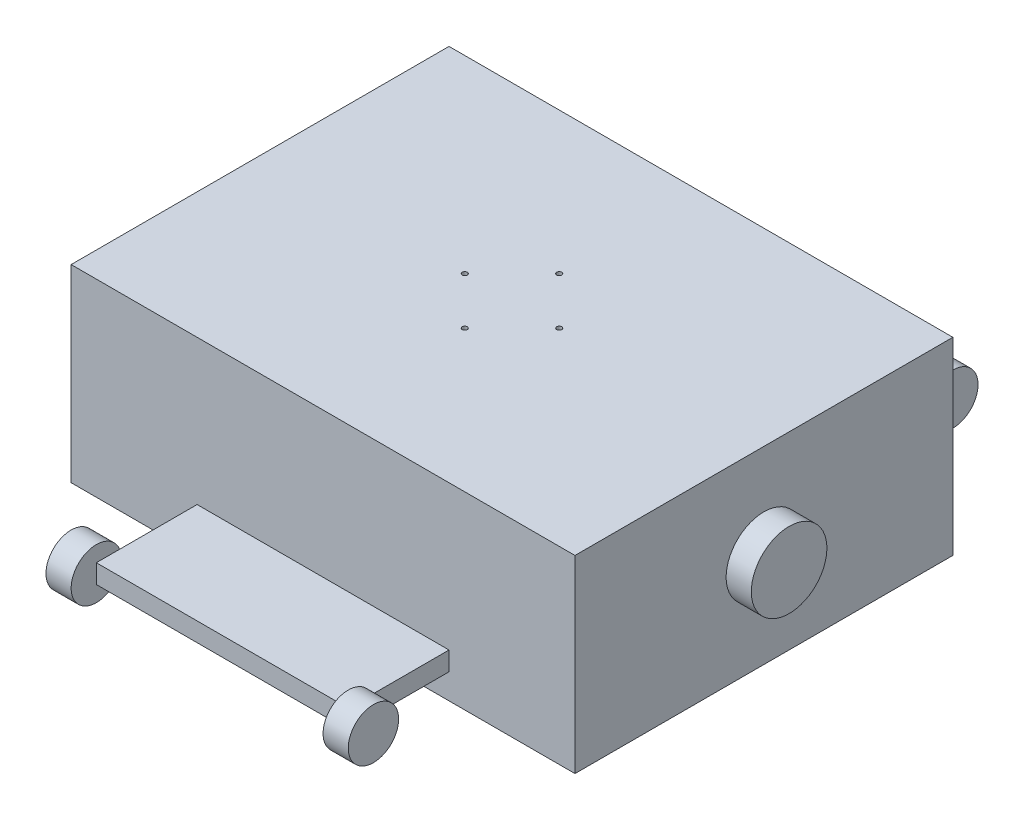
ISO-10303-21;
HEADER;
FILE_DESCRIPTION(('STEP AP214'),'2;1');
FILE_NAME('part.step','',(''),(''),'','','');
FILE_SCHEMA(('AUTOMOTIVE_DESIGN { 1 0 10303 214 1 1 1 1 }'));
ENDSEC;
DATA;
#1=APPLICATION_CONTEXT('core data for automotive mechanical design processes');
#2=APPLICATION_PROTOCOL_DEFINITION('international standard','automotive_design',2000,#1);
#3=PRODUCT_CONTEXT('',#1,'mechanical');
#4=PRODUCT('Part','Part','',(#3));
#5=PRODUCT_RELATED_PRODUCT_CATEGORY('part','',(#4));
#6=PRODUCT_DEFINITION_FORMATION('','',#4);
#7=PRODUCT_DEFINITION_CONTEXT('part definition',#1,'design');
#8=PRODUCT_DEFINITION('design','',#6,#7);
#9=PRODUCT_DEFINITION_SHAPE('','',#8);
#10=(LENGTH_UNIT() NAMED_UNIT(*) SI_UNIT(.MILLI.,.METRE.));
#11=(NAMED_UNIT(*) PLANE_ANGLE_UNIT() SI_UNIT($,.RADIAN.));
#12=(NAMED_UNIT(*) SI_UNIT($,.STERADIAN.) SOLID_ANGLE_UNIT());
#13=UNCERTAINTY_MEASURE_WITH_UNIT(LENGTH_MEASURE(1.E-05),#10,'distance_accuracy_value','');
#14=(GEOMETRIC_REPRESENTATION_CONTEXT(3) GLOBAL_UNCERTAINTY_ASSIGNED_CONTEXT((#13)) GLOBAL_UNIT_ASSIGNED_CONTEXT((#10,
#11,#12)) REPRESENTATION_CONTEXT('',''));
#15=CARTESIAN_POINT('',(0.,0.,0.));
#16=DIRECTION('',(0.,0.,1.));
#17=DIRECTION('',(1.,0.,0.));
#18=AXIS2_PLACEMENT_3D('',#15,#16,#17);
#19=CARTESIAN_POINT('',(0.,0.,0.));
#20=DIRECTION('',(0.,0.,1.));
#21=DIRECTION('',(1.,0.,0.));
#22=AXIS2_PLACEMENT_3D('',#19,#20,#21);
#23=PLANE('',#22);
#24=DIRECTION('',(0.,1.,0.));
#25=VECTOR('',#24,1.);
#26=CARTESIAN_POINT('',(200.,75.,0.));
#27=LINE('',#26,#25);
#28=CARTESIAN_POINT('',(200.,-75.,0.));
#29=VERTEX_POINT('',#28);
#30=CARTESIAN_POINT('',(200.,75.,0.));
#31=VERTEX_POINT('',#30);
#32=EDGE_CURVE('E201',#29,#31,#27,.T.);
#33=ORIENTED_EDGE('',*,*,#32,.T.);
#34=DIRECTION('',(-1.,0.,0.));
#35=VECTOR('',#34,1.);
#36=CARTESIAN_POINT('',(-200.,75.,0.));
#37=LINE('',#36,#35);
#38=CARTESIAN_POINT('',(-200.,75.,0.));
#39=VERTEX_POINT('',#38);
#40=EDGE_CURVE('E220',#31,#39,#37,.T.);
#41=ORIENTED_EDGE('',*,*,#40,.T.);
#42=DIRECTION('',(0.,-1.,0.));
#43=VECTOR('',#42,1.);
#44=CARTESIAN_POINT('',(-200.,75.,0.));
#45=LINE('',#44,#43);
#46=CARTESIAN_POINT('',(-200.,-75.,0.));
#47=VERTEX_POINT('',#46);
#48=EDGE_CURVE('E223',#39,#47,#45,.T.);
#49=ORIENTED_EDGE('',*,*,#48,.T.);
#50=DIRECTION('',(1.,0.,0.));
#51=VECTOR('',#50,1.);
#52=CARTESIAN_POINT('',(-200.,-75.,0.));
#53=LINE('',#52,#51);
#54=EDGE_CURVE('E209',#47,#29,#53,.T.);
#55=ORIENTED_EDGE('',*,*,#54,.T.);
#56=EDGE_LOOP('',(#33,#41,#49,#55));
#57=FACE_BOUND('',#56,.T.);
#58=DIRECTION('',(1.,0.,0.));
#59=VECTOR('',#58,1.);
#60=CARTESIAN_POINT('',(100.,-55.,0.));
#61=LINE('',#60,#59);
#62=CARTESIAN_POINT('',(-100.,-55.,0.));
#63=VERTEX_POINT('',#62);
#64=CARTESIAN_POINT('',(100.,-55.,0.));
#65=VERTEX_POINT('',#64);
#66=EDGE_CURVE('E495',#63,#65,#61,.T.);
#67=ORIENTED_EDGE('',*,*,#66,.F.);
#68=DIRECTION('',(0.,-1.,0.));
#69=VECTOR('',#68,1.);
#70=CARTESIAN_POINT('',(-100.,-55.,0.));
#71=LINE('',#70,#69);
#72=CARTESIAN_POINT('',(-100.,-40.,0.));
#73=VERTEX_POINT('',#72);
#74=EDGE_CURVE('E487',#73,#63,#71,.T.);
#75=ORIENTED_EDGE('',*,*,#74,.F.);
#76=DIRECTION('',(-1.,0.,0.));
#77=VECTOR('',#76,1.);
#78=CARTESIAN_POINT('',(100.,-40.,0.));
#79=LINE('',#78,#77);
#80=CARTESIAN_POINT('',(100.,-40.,0.));
#81=VERTEX_POINT('',#80);
#82=EDGE_CURVE('E182',#81,#73,#79,.T.);
#83=ORIENTED_EDGE('',*,*,#82,.F.);
#84=DIRECTION('',(0.,1.,0.));
#85=VECTOR('',#84,1.);
#86=CARTESIAN_POINT('',(100.,-55.,0.));
#87=LINE('',#86,#85);
#88=EDGE_CURVE('E497',#65,#81,#87,.T.);
#89=ORIENTED_EDGE('',*,*,#88,.F.);
#90=EDGE_LOOP('',(#67,#75,#83,#89));
#91=FACE_BOUND('',#90,.T.);
#92=ADVANCED_FACE('F39',(#57,#91),#23,.T.);
#93=CARTESIAN_POINT('',(200.,75.,-300.));
#94=DIRECTION('',(1.,0.,0.));
#95=DIRECTION('',(0.,1.,0.));
#96=AXIS2_PLACEMENT_3D('',#93,#94,#95);
#97=PLANE('',#96);
#98=CARTESIAN_POINT('',(200.,0.,-150.));
#99=DIRECTION('',(1.,0.,0.));
#100=DIRECTION('',(0.,1.,0.));
#101=AXIS2_PLACEMENT_3D('',#98,#99,#100);
#102=CIRCLE('',#101,30.);
#103=CARTESIAN_POINT('',(200.,30.,-150.));
#104=VERTEX_POINT('',#103);
#105=EDGE_CURVE('E48',#104,#104,#102,.T.);
#106=ORIENTED_EDGE('',*,*,#105,.F.);
#107=EDGE_LOOP('',(#106));
#108=FACE_BOUND('',#107,.T.);
#109=ORIENTED_EDGE('',*,*,#32,.F.);
#110=DIRECTION('',(0.,0.,1.));
#111=VECTOR('',#110,1.);
#112=CARTESIAN_POINT('',(200.,-75.,-300.));
#113=LINE('',#112,#111);
#114=CARTESIAN_POINT('',(200.,-75.,-300.));
#115=VERTEX_POINT('',#114);
#116=EDGE_CURVE('E204',#115,#29,#113,.T.);
#117=ORIENTED_EDGE('',*,*,#116,.F.);
#118=DIRECTION('',(0.,1.,0.));
#119=VECTOR('',#118,1.);
#120=CARTESIAN_POINT('',(200.,75.,-300.));
#121=LINE('',#120,#119);
#122=CARTESIAN_POINT('',(200.,75.,-300.));
#123=VERTEX_POINT('',#122);
#124=EDGE_CURVE('E205',#115,#123,#121,.T.);
#125=ORIENTED_EDGE('',*,*,#124,.T.);
#126=DIRECTION('',(0.,0.,1.));
#127=VECTOR('',#126,1.);
#128=CARTESIAN_POINT('',(200.,75.,-300.));
#129=LINE('',#128,#127);
#130=EDGE_CURVE('E43',#123,#31,#129,.T.);
#131=ORIENTED_EDGE('',*,*,#130,.T.);
#132=EDGE_LOOP('',(#109,#117,#125,#131));
#133=FACE_BOUND('',#132,.T.);
#134=ADVANCED_FACE('F41',(#108,#133),#97,.T.);
#135=CARTESIAN_POINT('',(-200.,-75.,-300.));
#136=DIRECTION('',(0.,-1.,0.));
#137=DIRECTION('',(0.,0.,-1.));
#138=AXIS2_PLACEMENT_3D('',#135,#136,#137);
#139=PLANE('',#138);
#140=ORIENTED_EDGE('',*,*,#54,.F.);
#141=DIRECTION('',(0.,0.,1.));
#142=VECTOR('',#141,1.);
#143=CARTESIAN_POINT('',(-200.,-75.,-300.));
#144=LINE('',#143,#142);
#145=CARTESIAN_POINT('',(-200.,-75.,-300.));
#146=VERTEX_POINT('',#145);
#147=EDGE_CURVE('E229',#146,#47,#144,.T.);
#148=ORIENTED_EDGE('',*,*,#147,.F.);
#149=DIRECTION('',(1.,0.,0.));
#150=VECTOR('',#149,1.);
#151=CARTESIAN_POINT('',(-200.,-75.,-300.));
#152=LINE('',#151,#150);
#153=EDGE_CURVE('E215',#146,#115,#152,.T.);
#154=ORIENTED_EDGE('',*,*,#153,.T.);
#155=ORIENTED_EDGE('',*,*,#116,.T.);
#156=EDGE_LOOP('',(#140,#148,#154,#155));
#157=FACE_BOUND('',#156,.T.);
#158=ADVANCED_FACE('F243',(#157),#139,.T.);
#159=CARTESIAN_POINT('',(-200.,75.,-300.));
#160=DIRECTION('',(-1.,0.,0.));
#161=DIRECTION('',(0.,-1.,0.));
#162=AXIS2_PLACEMENT_3D('',#159,#160,#161);
#163=PLANE('',#162);
#164=CARTESIAN_POINT('',(-200.,0.,-150.));
#165=DIRECTION('',(-1.,0.,0.));
#166=DIRECTION('',(0.,-1.,0.));
#167=AXIS2_PLACEMENT_3D('',#164,#165,#166);
#168=CIRCLE('',#167,30.);
#169=CARTESIAN_POINT('',(-200.,-30.,-150.));
#170=VERTEX_POINT('',#169);
#171=EDGE_CURVE('E11',#170,#170,#168,.T.);
#172=ORIENTED_EDGE('',*,*,#171,.F.);
#173=EDGE_LOOP('',(#172));
#174=FACE_BOUND('',#173,.T.);
#175=ORIENTED_EDGE('',*,*,#48,.F.);
#176=DIRECTION('',(0.,0.,1.));
#177=VECTOR('',#176,1.);
#178=CARTESIAN_POINT('',(-200.,75.,-300.));
#179=LINE('',#178,#177);
#180=CARTESIAN_POINT('',(-200.,75.,-300.));
#181=VERTEX_POINT('',#180);
#182=EDGE_CURVE('E230',#181,#39,#179,.T.);
#183=ORIENTED_EDGE('',*,*,#182,.F.);
#184=DIRECTION('',(0.,-1.,0.));
#185=VECTOR('',#184,1.);
#186=CARTESIAN_POINT('',(-200.,75.,-300.));
#187=LINE('',#186,#185);
#188=EDGE_CURVE('E212',#181,#146,#187,.T.);
#189=ORIENTED_EDGE('',*,*,#188,.T.);
#190=ORIENTED_EDGE('',*,*,#147,.T.);
#191=EDGE_LOOP('',(#175,#183,#189,#190));
#192=FACE_BOUND('',#191,.T.);
#193=ADVANCED_FACE('F249',(#174,#192),#163,.T.);
#194=CARTESIAN_POINT('',(-200.,75.,-300.));
#195=DIRECTION('',(0.,1.,0.));
#196=DIRECTION('',(0.,0.,1.));
#197=AXIS2_PLACEMENT_3D('',#194,#195,#196);
#198=PLANE('',#197);
#199=CARTESIAN_POINT('',(0.,75.,-187.5));
#200=DIRECTION('',(0.,1.,0.));
#201=DIRECTION('',(0.,0.,1.));
#202=AXIS2_PLACEMENT_3D('',#199,#200,#201);
#203=CIRCLE('',#202,2.);
#204=CARTESIAN_POINT('',(0.,75.,-185.5));
#205=VERTEX_POINT('',#204);
#206=EDGE_CURVE('E410',#205,#205,#203,.T.);
#207=ORIENTED_EDGE('',*,*,#206,.F.);
#208=EDGE_LOOP('',(#207));
#209=FACE_BOUND('',#208,.T.);
#210=CARTESIAN_POINT('',(37.5,75.,-150.));
#211=DIRECTION('',(0.,1.,0.));
#212=DIRECTION('',(0.,0.,1.));
#213=AXIS2_PLACEMENT_3D('',#210,#211,#212);
#214=CIRCLE('',#213,2.);
#215=CARTESIAN_POINT('',(37.5,75.,-148.));
#216=VERTEX_POINT('',#215);
#217=EDGE_CURVE('E416',#216,#216,#214,.T.);
#218=ORIENTED_EDGE('',*,*,#217,.F.);
#219=EDGE_LOOP('',(#218));
#220=FACE_BOUND('',#219,.T.);
#221=CARTESIAN_POINT('',(0.,75.,-112.5));
#222=DIRECTION('',(0.,1.,0.));
#223=DIRECTION('',(0.,0.,1.));
#224=AXIS2_PLACEMENT_3D('',#221,#222,#223);
#225=CIRCLE('',#224,2.);
#226=CARTESIAN_POINT('',(0.,75.,-110.5));
#227=VERTEX_POINT('',#226);
#228=EDGE_CURVE('E422',#227,#227,#225,.T.);
#229=ORIENTED_EDGE('',*,*,#228,.F.);
#230=EDGE_LOOP('',(#229));
#231=FACE_BOUND('',#230,.T.);
#232=CARTESIAN_POINT('',(-37.5,75.,-150.));
#233=DIRECTION('',(0.,1.,0.));
#234=DIRECTION('',(0.,0.,1.));
#235=AXIS2_PLACEMENT_3D('',#232,#233,#234);
#236=CIRCLE('',#235,2.);
#237=CARTESIAN_POINT('',(-37.5,75.,-148.));
#238=VERTEX_POINT('',#237);
#239=EDGE_CURVE('E402',#238,#238,#236,.T.);
#240=ORIENTED_EDGE('',*,*,#239,.F.);
#241=EDGE_LOOP('',(#240));
#242=FACE_BOUND('',#241,.T.);
#243=ORIENTED_EDGE('',*,*,#40,.F.);
#244=ORIENTED_EDGE('',*,*,#130,.F.);
#245=DIRECTION('',(-1.,0.,0.));
#246=VECTOR('',#245,1.);
#247=CARTESIAN_POINT('',(-200.,75.,-300.));
#248=LINE('',#247,#246);
#249=EDGE_CURVE('E208',#123,#181,#248,.T.);
#250=ORIENTED_EDGE('',*,*,#249,.T.);
#251=ORIENTED_EDGE('',*,*,#182,.T.);
#252=EDGE_LOOP('',(#243,#244,#250,#251));
#253=FACE_BOUND('',#252,.T.);
#254=ADVANCED_FACE('F238',(#209,#220,#231,#242,#253),#198,.T.);
#255=CARTESIAN_POINT('',(0.,0.,-300.));
#256=DIRECTION('',(0.,0.,1.));
#257=DIRECTION('',(1.,0.,0.));
#258=AXIS2_PLACEMENT_3D('',#255,#256,#257);
#259=PLANE('',#258);
#260=DIRECTION('',(-1.,0.,0.));
#261=VECTOR('',#260,1.);
#262=CARTESIAN_POINT('',(100.,-40.,-300.));
#263=LINE('',#262,#261);
#264=CARTESIAN_POINT('',(100.,-40.,-300.));
#265=VERTEX_POINT('',#264);
#266=CARTESIAN_POINT('',(-100.,-40.,-300.));
#267=VERTEX_POINT('',#266);
#268=EDGE_CURVE('E466',#265,#267,#263,.T.);
#269=ORIENTED_EDGE('',*,*,#268,.T.);
#270=DIRECTION('',(0.,-1.,0.));
#271=VECTOR('',#270,1.);
#272=CARTESIAN_POINT('',(-100.,-55.,-300.));
#273=LINE('',#272,#271);
#274=CARTESIAN_POINT('',(-100.,-55.,-300.));
#275=VERTEX_POINT('',#274);
#276=EDGE_CURVE('E446',#267,#275,#273,.T.);
#277=ORIENTED_EDGE('',*,*,#276,.T.);
#278=DIRECTION('',(1.,0.,0.));
#279=VECTOR('',#278,1.);
#280=CARTESIAN_POINT('',(100.,-55.,-300.));
#281=LINE('',#280,#279);
#282=CARTESIAN_POINT('',(100.,-55.,-300.));
#283=VERTEX_POINT('',#282);
#284=EDGE_CURVE('E454',#275,#283,#281,.T.);
#285=ORIENTED_EDGE('',*,*,#284,.T.);
#286=DIRECTION('',(0.,1.,0.));
#287=VECTOR('',#286,1.);
#288=CARTESIAN_POINT('',(100.,-55.,-300.));
#289=LINE('',#288,#287);
#290=EDGE_CURVE('E469',#283,#265,#289,.T.);
#291=ORIENTED_EDGE('',*,*,#290,.T.);
#292=EDGE_LOOP('',(#269,#277,#285,#291));
#293=FACE_BOUND('',#292,.T.);
#294=ORIENTED_EDGE('',*,*,#124,.F.);
#295=ORIENTED_EDGE('',*,*,#153,.F.);
#296=ORIENTED_EDGE('',*,*,#188,.F.);
#297=ORIENTED_EDGE('',*,*,#249,.F.);
#298=EDGE_LOOP('',(#294,#295,#296,#297));
#299=FACE_BOUND('',#298,.T.);
#300=ADVANCED_FACE('F246',(#293,#299),#259,.F.);
#301=CARTESIAN_POINT('',(220.,0.,-150.));
#302=DIRECTION('',(-1.,0.,0.));
#303=DIRECTION('',(0.,-1.,0.));
#304=AXIS2_PLACEMENT_3D('',#301,#302,#303);
#305=CYLINDRICAL_SURFACE('',#304,30.);
#306=CARTESIAN_POINT('',(220.,0.,-150.));
#307=DIRECTION('',(1.,0.,0.));
#308=DIRECTION('',(0.,1.,0.));
#309=AXIS2_PLACEMENT_3D('',#306,#307,#308);
#310=CIRCLE('',#309,30.);
#311=CARTESIAN_POINT('',(220.,30.,-150.));
#312=VERTEX_POINT('',#311);
#313=EDGE_CURVE('E198',#312,#312,#310,.T.);
#314=ORIENTED_EDGE('',*,*,#313,.F.);
#315=EDGE_LOOP('',(#314));
#316=FACE_BOUND('',#315,.T.);
#317=ORIENTED_EDGE('',*,*,#105,.T.);
#318=EDGE_LOOP('',(#317));
#319=FACE_BOUND('',#318,.T.);
#320=ADVANCED_FACE('F269',(#316,#319),#305,.T.);
#321=CARTESIAN_POINT('',(220.,0.,-150.));
#322=DIRECTION('',(1.,0.,0.));
#323=DIRECTION('',(0.,1.,0.));
#324=AXIS2_PLACEMENT_3D('',#321,#322,#323);
#325=PLANE('',#324);
#326=ORIENTED_EDGE('',*,*,#313,.T.);
#327=EDGE_LOOP('',(#326));
#328=FACE_BOUND('',#327,.T.);
#329=ADVANCED_FACE('F273',(#328),#325,.T.);
#330=CARTESIAN_POINT('',(-100.,-55.,80.));
#331=DIRECTION('',(1.,0.,0.));
#332=DIRECTION('',(0.,0.,-1.));
#333=AXIS2_PLACEMENT_3D('',#330,#331,#332);
#334=PLANE('',#333);
#335=DIRECTION('',(0.,0.,-1.));
#336=VECTOR('',#335,1.);
#337=CARTESIAN_POINT('',(-100.,-55.,80.));
#338=LINE('',#337,#336);
#339=CARTESIAN_POINT('',(-100.,-55.,61.4595037822609));
#340=VERTEX_POINT('',#339);
#341=EDGE_CURVE('E177',#340,#63,#338,.T.);
#342=ORIENTED_EDGE('',*,*,#341,.F.);
#343=CARTESIAN_POINT('',(-100.,-47.5,80.));
#344=DIRECTION('',(1.,0.,0.));
#345=DIRECTION('',(0.,0.,-1.));
#346=AXIS2_PLACEMENT_3D('',#343,#344,#345);
#347=CIRCLE('',#346,20.);
#348=CARTESIAN_POINT('',(-100.,-40.,61.4595037822608));
#349=VERTEX_POINT('',#348);
#350=EDGE_CURVE('E170',#340,#349,#347,.T.);
#351=ORIENTED_EDGE('',*,*,#350,.T.);
#352=DIRECTION('',(0.,0.,-1.));
#353=VECTOR('',#352,1.);
#354=CARTESIAN_POINT('',(-100.,-40.,80.));
#355=LINE('',#354,#353);
#356=EDGE_CURVE('E165',#349,#73,#355,.T.);
#357=ORIENTED_EDGE('',*,*,#356,.T.);
#358=ORIENTED_EDGE('',*,*,#74,.T.);
#359=EDGE_LOOP('',(#342,#351,#357,#358));
#360=FACE_BOUND('',#359,.T.);
#361=ADVANCED_FACE('F174',(#360),#334,.F.);
#362=CARTESIAN_POINT('',(100.,-55.,80.));
#363=DIRECTION('',(0.,1.,0.));
#364=DIRECTION('',(-1.,0.,0.));
#365=AXIS2_PLACEMENT_3D('',#362,#363,#364);
#366=PLANE('',#365);
#367=ORIENTED_EDGE('',*,*,#66,.T.);
#368=DIRECTION('',(0.,0.,-1.));
#369=VECTOR('',#368,1.);
#370=CARTESIAN_POINT('',(100.,-55.,80.));
#371=LINE('',#370,#369);
#372=CARTESIAN_POINT('',(100.,-55.,61.4595037822608));
#373=VERTEX_POINT('',#372);
#374=EDGE_CURVE('E193',#373,#65,#371,.T.);
#375=ORIENTED_EDGE('',*,*,#374,.F.);
#376=CARTESIAN_POINT('',(100.,-55.,80.));
#377=VERTEX_POINT('',#376);
#378=EDGE_CURVE('E194',#377,#373,#371,.T.);
#379=ORIENTED_EDGE('',*,*,#378,.F.);
#380=DIRECTION('',(1.,0.,0.));
#381=VECTOR('',#380,1.);
#382=CARTESIAN_POINT('',(100.,-55.,80.));
#383=LINE('',#382,#381);
#384=CARTESIAN_POINT('',(-100.,-55.,80.));
#385=VERTEX_POINT('',#384);
#386=EDGE_CURVE('E489',#385,#377,#383,.T.);
#387=ORIENTED_EDGE('',*,*,#386,.F.);
#388=EDGE_CURVE('E196',#385,#340,#338,.T.);
#389=ORIENTED_EDGE('',*,*,#388,.T.);
#390=ORIENTED_EDGE('',*,*,#341,.T.);
#391=EDGE_LOOP('',(#367,#375,#379,#387,#389,#390));
#392=FACE_BOUND('',#391,.T.);
#393=ADVANCED_FACE('F280',(#392),#366,.F.);
#394=CARTESIAN_POINT('',(100.,-55.,80.));
#395=DIRECTION('',(-1.,0.,0.));
#396=DIRECTION('',(0.,0.,1.));
#397=AXIS2_PLACEMENT_3D('',#394,#395,#396);
#398=PLANE('',#397);
#399=CARTESIAN_POINT('',(100.,-47.5,80.));
#400=DIRECTION('',(1.,0.,0.));
#401=DIRECTION('',(0.,0.,-1.));
#402=AXIS2_PLACEMENT_3D('',#399,#400,#401);
#403=CIRCLE('',#402,20.);
#404=CARTESIAN_POINT('',(100.,-40.,61.4595037822608));
#405=VERTEX_POINT('',#404);
#406=EDGE_CURVE('E439',#373,#405,#403,.T.);
#407=ORIENTED_EDGE('',*,*,#406,.F.);
#408=ORIENTED_EDGE('',*,*,#374,.T.);
#409=ORIENTED_EDGE('',*,*,#88,.T.);
#410=DIRECTION('',(0.,0.,-1.));
#411=VECTOR('',#410,1.);
#412=CARTESIAN_POINT('',(100.,-40.,80.));
#413=LINE('',#412,#411);
#414=EDGE_CURVE('E164',#405,#81,#413,.T.);
#415=ORIENTED_EDGE('',*,*,#414,.F.);
#416=EDGE_LOOP('',(#407,#408,#409,#415));
#417=FACE_BOUND('',#416,.T.);
#418=ADVANCED_FACE('F283',(#417),#398,.F.);
#419=CARTESIAN_POINT('',(100.,-40.,80.));
#420=DIRECTION('',(0.,-1.,0.));
#421=DIRECTION('',(1.,0.,0.));
#422=AXIS2_PLACEMENT_3D('',#419,#420,#421);
#423=PLANE('',#422);
#424=ORIENTED_EDGE('',*,*,#82,.T.);
#425=ORIENTED_EDGE('',*,*,#356,.F.);
#426=CARTESIAN_POINT('',(-100.,-40.,80.));
#427=VERTEX_POINT('',#426);
#428=EDGE_CURVE('E153',#427,#349,#355,.T.);
#429=ORIENTED_EDGE('',*,*,#428,.F.);
#430=DIRECTION('',(-1.,0.,0.));
#431=VECTOR('',#430,1.);
#432=CARTESIAN_POINT('',(100.,-40.,80.));
#433=LINE('',#432,#431);
#434=CARTESIAN_POINT('',(100.,-40.,80.));
#435=VERTEX_POINT('',#434);
#436=EDGE_CURVE('E184',#435,#427,#433,.T.);
#437=ORIENTED_EDGE('',*,*,#436,.F.);
#438=EDGE_CURVE('E190',#435,#405,#413,.T.);
#439=ORIENTED_EDGE('',*,*,#438,.T.);
#440=ORIENTED_EDGE('',*,*,#414,.T.);
#441=EDGE_LOOP('',(#424,#425,#429,#437,#439,#440));
#442=FACE_BOUND('',#441,.T.);
#443=ADVANCED_FACE('F180',(#442),#423,.F.);
#444=CARTESIAN_POINT('',(0.,0.,80.));
#445=DIRECTION('',(0.,0.,1.));
#446=DIRECTION('',(1.,0.,0.));
#447=AXIS2_PLACEMENT_3D('',#444,#445,#446);
#448=PLANE('',#447);
#449=DIRECTION('',(0.,-1.,0.));
#450=VECTOR('',#449,1.);
#451=CARTESIAN_POINT('',(-100.,-55.,80.));
#452=LINE('',#451,#450);
#453=EDGE_CURVE('E159',#427,#385,#452,.T.);
#454=ORIENTED_EDGE('',*,*,#453,.T.);
#455=ORIENTED_EDGE('',*,*,#386,.T.);
#456=DIRECTION('',(0.,1.,0.));
#457=VECTOR('',#456,1.);
#458=CARTESIAN_POINT('',(100.,-55.,80.));
#459=LINE('',#458,#457);
#460=EDGE_CURVE('E185',#377,#435,#459,.T.);
#461=ORIENTED_EDGE('',*,*,#460,.T.);
#462=ORIENTED_EDGE('',*,*,#436,.T.);
#463=EDGE_LOOP('',(#454,#455,#461,#462));
#464=FACE_BOUND('',#463,.T.);
#465=ADVANCED_FACE('F290',(#464),#448,.T.);
#466=CARTESIAN_POINT('',(-100.,-55.,-380.));
#467=DIRECTION('',(-1.,0.,0.));
#468=DIRECTION('',(0.,0.,1.));
#469=AXIS2_PLACEMENT_3D('',#466,#467,#468);
#470=PLANE('',#469);
#471=DIRECTION('',(0.,0.,1.));
#472=VECTOR('',#471,1.);
#473=CARTESIAN_POINT('',(-100.,-40.,-380.));
#474=LINE('',#473,#472);
#475=CARTESIAN_POINT('',(-100.,-40.,-361.459503782261));
#476=VERTEX_POINT('',#475);
#477=EDGE_CURVE('E56',#476,#267,#474,.T.);
#478=ORIENTED_EDGE('',*,*,#477,.F.);
#479=CARTESIAN_POINT('',(-100.,-47.5,-380.));
#480=DIRECTION('',(-1.,0.,0.));
#481=DIRECTION('',(0.,0.,1.));
#482=AXIS2_PLACEMENT_3D('',#479,#480,#481);
#483=CIRCLE('',#482,20.);
#484=CARTESIAN_POINT('',(-100.,-55.,-361.459503782261));
#485=VERTEX_POINT('',#484);
#486=EDGE_CURVE('E61',#485,#476,#483,.T.);
#487=ORIENTED_EDGE('',*,*,#486,.F.);
#488=DIRECTION('',(0.,0.,1.));
#489=VECTOR('',#488,1.);
#490=CARTESIAN_POINT('',(-100.,-55.,-380.));
#491=LINE('',#490,#489);
#492=EDGE_CURVE('E463',#485,#275,#491,.T.);
#493=ORIENTED_EDGE('',*,*,#492,.T.);
#494=ORIENTED_EDGE('',*,*,#276,.F.);
#495=EDGE_LOOP('',(#478,#487,#493,#494));
#496=FACE_BOUND('',#495,.T.);
#497=ADVANCED_FACE('F293',(#496),#470,.T.);
#498=CARTESIAN_POINT('',(100.,-40.,-380.));
#499=DIRECTION('',(0.,1.,0.));
#500=DIRECTION('',(-1.,0.,0.));
#501=AXIS2_PLACEMENT_3D('',#498,#499,#500);
#502=PLANE('',#501);
#503=ORIENTED_EDGE('',*,*,#268,.F.);
#504=DIRECTION('',(0.,0.,1.));
#505=VECTOR('',#504,1.);
#506=CARTESIAN_POINT('',(100.,-40.,-380.));
#507=LINE('',#506,#505);
#508=CARTESIAN_POINT('',(100.,-40.,-361.459503782261));
#509=VERTEX_POINT('',#508);
#510=EDGE_CURVE('E481',#509,#265,#507,.T.);
#511=ORIENTED_EDGE('',*,*,#510,.F.);
#512=CARTESIAN_POINT('',(100.,-40.,-380.));
#513=VERTEX_POINT('',#512);
#514=EDGE_CURVE('E482',#513,#509,#507,.T.);
#515=ORIENTED_EDGE('',*,*,#514,.F.);
#516=DIRECTION('',(-1.,0.,0.));
#517=VECTOR('',#516,1.);
#518=CARTESIAN_POINT('',(100.,-40.,-380.));
#519=LINE('',#518,#517);
#520=CARTESIAN_POINT('',(-100.,-40.,-380.));
#521=VERTEX_POINT('',#520);
#522=EDGE_CURVE('E453',#513,#521,#519,.T.);
#523=ORIENTED_EDGE('',*,*,#522,.T.);
#524=EDGE_CURVE('E485',#521,#476,#474,.T.);
#525=ORIENTED_EDGE('',*,*,#524,.T.);
#526=ORIENTED_EDGE('',*,*,#477,.T.);
#527=EDGE_LOOP('',(#503,#511,#515,#523,#525,#526));
#528=FACE_BOUND('',#527,.T.);
#529=ADVANCED_FACE('F297',(#528),#502,.T.);
#530=CARTESIAN_POINT('',(100.,-55.,-380.));
#531=DIRECTION('',(1.,0.,0.));
#532=DIRECTION('',(0.,0.,-1.));
#533=AXIS2_PLACEMENT_3D('',#530,#531,#532);
#534=PLANE('',#533);
#535=CARTESIAN_POINT('',(100.,-47.5,-380.));
#536=DIRECTION('',(-1.,0.,0.));
#537=DIRECTION('',(0.,0.,1.));
#538=AXIS2_PLACEMENT_3D('',#535,#536,#537);
#539=CIRCLE('',#538,20.);
#540=CARTESIAN_POINT('',(100.,-55.,-361.459503782261));
#541=VERTEX_POINT('',#540);
#542=EDGE_CURVE('E432',#541,#509,#539,.T.);
#543=ORIENTED_EDGE('',*,*,#542,.T.);
#544=ORIENTED_EDGE('',*,*,#510,.T.);
#545=ORIENTED_EDGE('',*,*,#290,.F.);
#546=DIRECTION('',(0.,0.,1.));
#547=VECTOR('',#546,1.);
#548=CARTESIAN_POINT('',(100.,-55.,-380.));
#549=LINE('',#548,#547);
#550=EDGE_CURVE('E477',#541,#283,#549,.T.);
#551=ORIENTED_EDGE('',*,*,#550,.F.);
#552=EDGE_LOOP('',(#543,#544,#545,#551));
#553=FACE_BOUND('',#552,.T.);
#554=ADVANCED_FACE('F300',(#553),#534,.T.);
#555=CARTESIAN_POINT('',(100.,-55.,-380.));
#556=DIRECTION('',(0.,-1.,0.));
#557=DIRECTION('',(1.,0.,0.));
#558=AXIS2_PLACEMENT_3D('',#555,#556,#557);
#559=PLANE('',#558);
#560=ORIENTED_EDGE('',*,*,#284,.F.);
#561=ORIENTED_EDGE('',*,*,#492,.F.);
#562=CARTESIAN_POINT('',(-100.,-55.,-380.));
#563=VERTEX_POINT('',#562);
#564=EDGE_CURVE('E474',#563,#485,#491,.T.);
#565=ORIENTED_EDGE('',*,*,#564,.F.);
#566=DIRECTION('',(1.,0.,0.));
#567=VECTOR('',#566,1.);
#568=CARTESIAN_POINT('',(100.,-55.,-380.));
#569=LINE('',#568,#567);
#570=CARTESIAN_POINT('',(100.,-55.,-380.));
#571=VERTEX_POINT('',#570);
#572=EDGE_CURVE('E460',#563,#571,#569,.T.);
#573=ORIENTED_EDGE('',*,*,#572,.T.);
#574=EDGE_CURVE('E478',#571,#541,#549,.T.);
#575=ORIENTED_EDGE('',*,*,#574,.T.);
#576=ORIENTED_EDGE('',*,*,#550,.T.);
#577=EDGE_LOOP('',(#560,#561,#565,#573,#575,#576));
#578=FACE_BOUND('',#577,.T.);
#579=ADVANCED_FACE('F304',(#578),#559,.T.);
#580=CARTESIAN_POINT('',(0.,0.,-380.));
#581=DIRECTION('',(0.,0.,-1.));
#582=DIRECTION('',(1.,0.,0.));
#583=AXIS2_PLACEMENT_3D('',#580,#581,#582);
#584=PLANE('',#583);
#585=DIRECTION('',(0.,-1.,0.));
#586=VECTOR('',#585,1.);
#587=CARTESIAN_POINT('',(-100.,-55.,-380.));
#588=LINE('',#587,#586);
#589=EDGE_CURVE('E450',#521,#563,#588,.T.);
#590=ORIENTED_EDGE('',*,*,#589,.F.);
#591=ORIENTED_EDGE('',*,*,#522,.F.);
#592=DIRECTION('',(0.,1.,0.));
#593=VECTOR('',#592,1.);
#594=CARTESIAN_POINT('',(100.,-55.,-380.));
#595=LINE('',#594,#593);
#596=EDGE_CURVE('E457',#571,#513,#595,.T.);
#597=ORIENTED_EDGE('',*,*,#596,.F.);
#598=ORIENTED_EDGE('',*,*,#572,.F.);
#599=EDGE_LOOP('',(#590,#591,#597,#598));
#600=FACE_BOUND('',#599,.T.);
#601=ADVANCED_FACE('F308',(#600),#584,.T.);
#602=CARTESIAN_POINT('',(100.,-47.5,80.));
#603=DIRECTION('',(1.,0.,0.));
#604=DIRECTION('',(0.,0.,-1.));
#605=AXIS2_PLACEMENT_3D('',#602,#603,#604);
#606=PLANE('',#605);
#607=ORIENTED_EDGE('',*,*,#460,.F.);
#608=ORIENTED_EDGE('',*,*,#378,.T.);
#609=EDGE_CURVE('E447',#405,#373,#403,.T.);
#610=ORIENTED_EDGE('',*,*,#609,.F.);
#611=ORIENTED_EDGE('',*,*,#438,.F.);
#612=EDGE_LOOP('',(#607,#608,#610,#611));
#613=FACE_BOUND('',#612,.T.);
#614=ADVANCED_FACE('F312',(#613),#606,.F.);
#615=CARTESIAN_POINT('',(120.,-47.5,80.));
#616=DIRECTION('',(-1.,0.,0.));
#617=DIRECTION('',(0.,0.,1.));
#618=AXIS2_PLACEMENT_3D('',#615,#616,#617);
#619=CYLINDRICAL_SURFACE('',#618,20.);
#620=CARTESIAN_POINT('',(120.,-47.5,80.));
#621=DIRECTION('',(1.,0.,0.));
#622=DIRECTION('',(0.,0.,-1.));
#623=AXIS2_PLACEMENT_3D('',#620,#621,#622);
#624=CIRCLE('',#623,20.);
#625=CARTESIAN_POINT('',(120.,-47.5,60.));
#626=VERTEX_POINT('',#625);
#627=EDGE_CURVE('E443',#626,#626,#624,.T.);
#628=ORIENTED_EDGE('',*,*,#627,.F.);
#629=EDGE_LOOP('',(#628));
#630=FACE_BOUND('',#629,.T.);
#631=ORIENTED_EDGE('',*,*,#609,.T.);
#632=ORIENTED_EDGE('',*,*,#406,.T.);
#633=EDGE_LOOP('',(#631,#632));
#634=FACE_BOUND('',#633,.T.);
#635=ADVANCED_FACE('F314',(#630,#634),#619,.T.);
#636=CARTESIAN_POINT('',(120.,-47.5,80.));
#637=DIRECTION('',(1.,0.,0.));
#638=DIRECTION('',(0.,0.,-1.));
#639=AXIS2_PLACEMENT_3D('',#636,#637,#638);
#640=PLANE('',#639);
#641=ORIENTED_EDGE('',*,*,#627,.T.);
#642=EDGE_LOOP('',(#641));
#643=FACE_BOUND('',#642,.T.);
#644=ADVANCED_FACE('F317',(#643),#640,.T.);
#645=CARTESIAN_POINT('',(120.,-47.5,-380.));
#646=DIRECTION('',(-1.,0.,0.));
#647=DIRECTION('',(0.,0.,1.));
#648=AXIS2_PLACEMENT_3D('',#645,#646,#647);
#649=CYLINDRICAL_SURFACE('',#648,20.);
#650=CARTESIAN_POINT('',(120.,-47.5,-380.));
#651=DIRECTION('',(-1.,0.,0.));
#652=DIRECTION('',(0.,0.,1.));
#653=AXIS2_PLACEMENT_3D('',#650,#651,#652);
#654=CIRCLE('',#653,20.);
#655=CARTESIAN_POINT('',(120.,-47.5,-360.));
#656=VERTEX_POINT('',#655);
#657=EDGE_CURVE('E436',#656,#656,#654,.T.);
#658=ORIENTED_EDGE('',*,*,#657,.T.);
#659=EDGE_LOOP('',(#658));
#660=FACE_BOUND('',#659,.T.);
#661=EDGE_CURVE('E440',#509,#541,#539,.T.);
#662=ORIENTED_EDGE('',*,*,#661,.F.);
#663=ORIENTED_EDGE('',*,*,#542,.F.);
#664=EDGE_LOOP('',(#662,#663));
#665=FACE_BOUND('',#664,.T.);
#666=ADVANCED_FACE('F324',(#660,#665),#649,.T.);
#667=CARTESIAN_POINT('',(120.,-47.5,-380.));
#668=DIRECTION('',(1.,0.,0.));
#669=DIRECTION('',(0.,0.,1.));
#670=AXIS2_PLACEMENT_3D('',#667,#668,#669);
#671=PLANE('',#670);
#672=ORIENTED_EDGE('',*,*,#657,.F.);
#673=EDGE_LOOP('',(#672));
#674=FACE_BOUND('',#673,.T.);
#675=ADVANCED_FACE('F328',(#674),#671,.T.);
#676=CARTESIAN_POINT('',(100.,-47.5,-380.));
#677=DIRECTION('',(1.,0.,0.));
#678=DIRECTION('',(0.,0.,1.));
#679=AXIS2_PLACEMENT_3D('',#676,#677,#678);
#680=PLANE('',#679);
#681=ORIENTED_EDGE('',*,*,#514,.T.);
#682=ORIENTED_EDGE('',*,*,#661,.T.);
#683=ORIENTED_EDGE('',*,*,#574,.F.);
#684=ORIENTED_EDGE('',*,*,#596,.T.);
#685=EDGE_LOOP('',(#681,#682,#683,#684));
#686=FACE_BOUND('',#685,.T.);
#687=ADVANCED_FACE('F330',(#686),#680,.F.);
#688=CARTESIAN_POINT('',(-120.,-47.5,-380.));
#689=DIRECTION('',(1.,0.,0.));
#690=DIRECTION('',(0.,0.,-1.));
#691=AXIS2_PLACEMENT_3D('',#688,#689,#690);
#692=CYLINDRICAL_SURFACE('',#691,20.);
#693=CARTESIAN_POINT('',(-120.,-47.5,-380.));
#694=DIRECTION('',(-1.,0.,0.));
#695=DIRECTION('',(0.,0.,1.));
#696=AXIS2_PLACEMENT_3D('',#693,#694,#695);
#697=CIRCLE('',#696,20.);
#698=CARTESIAN_POINT('',(-120.,-47.5,-360.));
#699=VERTEX_POINT('',#698);
#700=EDGE_CURVE('E429',#699,#699,#697,.T.);
#701=ORIENTED_EDGE('',*,*,#700,.F.);
#702=EDGE_LOOP('',(#701));
#703=FACE_BOUND('',#702,.T.);
#704=EDGE_CURVE('E433',#476,#485,#483,.T.);
#705=ORIENTED_EDGE('',*,*,#704,.T.);
#706=ORIENTED_EDGE('',*,*,#486,.T.);
#707=EDGE_LOOP('',(#705,#706));
#708=FACE_BOUND('',#707,.T.);
#709=ADVANCED_FACE('F333',(#703,#708),#692,.T.);
#710=CARTESIAN_POINT('',(-120.,-47.5,-380.));
#711=DIRECTION('',(-1.,0.,0.));
#712=DIRECTION('',(0.,0.,1.));
#713=AXIS2_PLACEMENT_3D('',#710,#711,#712);
#714=PLANE('',#713);
#715=ORIENTED_EDGE('',*,*,#700,.T.);
#716=EDGE_LOOP('',(#715));
#717=FACE_BOUND('',#716,.T.);
#718=ADVANCED_FACE('F340',(#717),#714,.T.);
#719=CARTESIAN_POINT('',(-100.,-47.5,-380.));
#720=DIRECTION('',(-1.,0.,0.));
#721=DIRECTION('',(0.,0.,1.));
#722=AXIS2_PLACEMENT_3D('',#719,#720,#721);
#723=PLANE('',#722);
#724=ORIENTED_EDGE('',*,*,#524,.F.);
#725=ORIENTED_EDGE('',*,*,#589,.T.);
#726=ORIENTED_EDGE('',*,*,#564,.T.);
#727=ORIENTED_EDGE('',*,*,#704,.F.);
#728=EDGE_LOOP('',(#724,#725,#726,#727));
#729=FACE_BOUND('',#728,.T.);
#730=ADVANCED_FACE('F342',(#729),#723,.F.);
#731=CARTESIAN_POINT('',(-100.,-47.5,80.));
#732=DIRECTION('',(-1.,0.,0.));
#733=DIRECTION('',(0.,0.,-1.));
#734=AXIS2_PLACEMENT_3D('',#731,#732,#733);
#735=PLANE('',#734);
#736=EDGE_CURVE('E156',#349,#340,#347,.T.);
#737=ORIENTED_EDGE('',*,*,#736,.T.);
#738=ORIENTED_EDGE('',*,*,#388,.F.);
#739=ORIENTED_EDGE('',*,*,#453,.F.);
#740=ORIENTED_EDGE('',*,*,#428,.T.);
#741=EDGE_LOOP('',(#737,#738,#739,#740));
#742=FACE_BOUND('',#741,.T.);
#743=ADVANCED_FACE('F155',(#742),#735,.F.);
#744=CARTESIAN_POINT('',(-120.,-47.5,80.));
#745=DIRECTION('',(1.,0.,0.));
#746=DIRECTION('',(0.,0.,-1.));
#747=AXIS2_PLACEMENT_3D('',#744,#745,#746);
#748=CYLINDRICAL_SURFACE('',#747,20.);
#749=CARTESIAN_POINT('',(-120.,-47.5,80.));
#750=DIRECTION('',(1.,0.,0.));
#751=DIRECTION('',(0.,0.,-1.));
#752=AXIS2_PLACEMENT_3D('',#749,#750,#751);
#753=CIRCLE('',#752,20.);
#754=CARTESIAN_POINT('',(-120.,-47.5,60.));
#755=VERTEX_POINT('',#754);
#756=EDGE_CURVE('E171',#755,#755,#753,.T.);
#757=ORIENTED_EDGE('',*,*,#756,.T.);
#758=EDGE_LOOP('',(#757));
#759=FACE_BOUND('',#758,.T.);
#760=ORIENTED_EDGE('',*,*,#736,.F.);
#761=ORIENTED_EDGE('',*,*,#350,.F.);
#762=EDGE_LOOP('',(#760,#761));
#763=FACE_BOUND('',#762,.T.);
#764=ADVANCED_FACE('F169',(#759,#763),#748,.T.);
#765=CARTESIAN_POINT('',(-120.,-47.5,80.));
#766=DIRECTION('',(-1.,0.,0.));
#767=DIRECTION('',(0.,0.,-1.));
#768=AXIS2_PLACEMENT_3D('',#765,#766,#767);
#769=PLANE('',#768);
#770=ORIENTED_EDGE('',*,*,#756,.F.);
#771=EDGE_LOOP('',(#770));
#772=FACE_BOUND('',#771,.T.);
#773=ADVANCED_FACE('F351',(#772),#769,.T.);
#774=CARTESIAN_POINT('',(-37.5,65.,-150.));
#775=DIRECTION('',(0.,1.,0.));
#776=DIRECTION('',(0.,0.,1.));
#777=AXIS2_PLACEMENT_3D('',#774,#775,#776);
#778=CYLINDRICAL_SURFACE('',#777,2.);
#779=CARTESIAN_POINT('',(-37.5,65.,-150.));
#780=DIRECTION('',(0.,1.,0.));
#781=DIRECTION('',(0.,0.,1.));
#782=AXIS2_PLACEMENT_3D('',#779,#780,#781);
#783=CIRCLE('',#782,2.);
#784=CARTESIAN_POINT('',(-37.5,65.,-148.));
#785=VERTEX_POINT('',#784);
#786=EDGE_CURVE('E405',#785,#785,#783,.T.);
#787=ORIENTED_EDGE('',*,*,#786,.F.);
#788=EDGE_LOOP('',(#787));
#789=FACE_BOUND('',#788,.T.);
#790=ORIENTED_EDGE('',*,*,#239,.T.);
#791=EDGE_LOOP('',(#790));
#792=FACE_BOUND('',#791,.T.);
#793=ADVANCED_FACE('F357',(#789,#792),#778,.F.);
#794=CARTESIAN_POINT('',(-37.5,65.,-150.));
#795=DIRECTION('',(0.,1.,0.));
#796=DIRECTION('',(0.,0.,1.));
#797=AXIS2_PLACEMENT_3D('',#794,#795,#796);
#798=PLANE('',#797);
#799=ORIENTED_EDGE('',*,*,#786,.T.);
#800=EDGE_LOOP('',(#799));
#801=FACE_BOUND('',#800,.T.);
#802=ADVANCED_FACE('F361',(#801),#798,.T.);
#803=CARTESIAN_POINT('',(0.,65.,-112.5));
#804=DIRECTION('',(0.,1.,0.));
#805=DIRECTION('',(0.,0.,1.));
#806=AXIS2_PLACEMENT_3D('',#803,#804,#805);
#807=CYLINDRICAL_SURFACE('',#806,2.);
#808=CARTESIAN_POINT('',(0.,65.,-112.5));
#809=DIRECTION('',(0.,1.,0.));
#810=DIRECTION('',(0.,0.,1.));
#811=AXIS2_PLACEMENT_3D('',#808,#809,#810);
#812=CIRCLE('',#811,2.);
#813=CARTESIAN_POINT('',(0.,65.,-110.5));
#814=VERTEX_POINT('',#813);
#815=EDGE_CURVE('E419',#814,#814,#812,.T.);
#816=ORIENTED_EDGE('',*,*,#815,.F.);
#817=EDGE_LOOP('',(#816));
#818=FACE_BOUND('',#817,.T.);
#819=ORIENTED_EDGE('',*,*,#228,.T.);
#820=EDGE_LOOP('',(#819));
#821=FACE_BOUND('',#820,.T.);
#822=ADVANCED_FACE('F365',(#818,#821),#807,.F.);
#823=CARTESIAN_POINT('',(0.,65.,-112.5));
#824=DIRECTION('',(0.,1.,0.));
#825=DIRECTION('',(0.,0.,1.));
#826=AXIS2_PLACEMENT_3D('',#823,#824,#825);
#827=PLANE('',#826);
#828=ORIENTED_EDGE('',*,*,#815,.T.);
#829=EDGE_LOOP('',(#828));
#830=FACE_BOUND('',#829,.T.);
#831=ADVANCED_FACE('F369',(#830),#827,.T.);
#832=CARTESIAN_POINT('',(37.5,65.,-150.));
#833=DIRECTION('',(0.,1.,0.));
#834=DIRECTION('',(0.,0.,1.));
#835=AXIS2_PLACEMENT_3D('',#832,#833,#834);
#836=CYLINDRICAL_SURFACE('',#835,2.);
#837=CARTESIAN_POINT('',(37.5,65.,-150.));
#838=DIRECTION('',(0.,1.,0.));
#839=DIRECTION('',(0.,0.,1.));
#840=AXIS2_PLACEMENT_3D('',#837,#838,#839);
#841=CIRCLE('',#840,2.);
#842=CARTESIAN_POINT('',(37.5,65.,-148.));
#843=VERTEX_POINT('',#842);
#844=EDGE_CURVE('E413',#843,#843,#841,.T.);
#845=ORIENTED_EDGE('',*,*,#844,.F.);
#846=EDGE_LOOP('',(#845));
#847=FACE_BOUND('',#846,.T.);
#848=ORIENTED_EDGE('',*,*,#217,.T.);
#849=EDGE_LOOP('',(#848));
#850=FACE_BOUND('',#849,.T.);
#851=ADVANCED_FACE('F373',(#847,#850),#836,.F.);
#852=CARTESIAN_POINT('',(37.5,65.,-150.));
#853=DIRECTION('',(0.,1.,0.));
#854=DIRECTION('',(0.,0.,1.));
#855=AXIS2_PLACEMENT_3D('',#852,#853,#854);
#856=PLANE('',#855);
#857=ORIENTED_EDGE('',*,*,#844,.T.);
#858=EDGE_LOOP('',(#857));
#859=FACE_BOUND('',#858,.T.);
#860=ADVANCED_FACE('F377',(#859),#856,.T.);
#861=CARTESIAN_POINT('',(0.,65.,-187.5));
#862=DIRECTION('',(0.,1.,0.));
#863=DIRECTION('',(0.,0.,1.));
#864=AXIS2_PLACEMENT_3D('',#861,#862,#863);
#865=CYLINDRICAL_SURFACE('',#864,2.);
#866=CARTESIAN_POINT('',(0.,65.,-187.5));
#867=DIRECTION('',(0.,1.,0.));
#868=DIRECTION('',(0.,0.,1.));
#869=AXIS2_PLACEMENT_3D('',#866,#867,#868);
#870=CIRCLE('',#869,2.);
#871=CARTESIAN_POINT('',(0.,65.,-185.5));
#872=VERTEX_POINT('',#871);
#873=EDGE_CURVE('E179',#872,#872,#870,.T.);
#874=ORIENTED_EDGE('',*,*,#873,.F.);
#875=EDGE_LOOP('',(#874));
#876=FACE_BOUND('',#875,.T.);
#877=ORIENTED_EDGE('',*,*,#206,.T.);
#878=EDGE_LOOP('',(#877));
#879=FACE_BOUND('',#878,.T.);
#880=ADVANCED_FACE('F381',(#876,#879),#865,.F.);
#881=CARTESIAN_POINT('',(0.,65.,-187.5));
#882=DIRECTION('',(0.,1.,0.));
#883=DIRECTION('',(0.,0.,1.));
#884=AXIS2_PLACEMENT_3D('',#881,#882,#883);
#885=PLANE('',#884);
#886=ORIENTED_EDGE('',*,*,#873,.T.);
#887=EDGE_LOOP('',(#886));
#888=FACE_BOUND('',#887,.T.);
#889=ADVANCED_FACE('F385',(#888),#885,.T.);
#890=CARTESIAN_POINT('',(-220.,0.,-150.));
#891=DIRECTION('',(1.,0.,0.));
#892=DIRECTION('',(0.,1.,0.));
#893=AXIS2_PLACEMENT_3D('',#890,#891,#892);
#894=CYLINDRICAL_SURFACE('',#893,30.);
#895=CARTESIAN_POINT('',(-220.,0.,-150.));
#896=DIRECTION('',(-1.,0.,0.));
#897=DIRECTION('',(0.,-1.,0.));
#898=AXIS2_PLACEMENT_3D('',#895,#896,#897);
#899=CIRCLE('',#898,30.);
#900=CARTESIAN_POINT('',(-220.,-30.,-150.));
#901=VERTEX_POINT('',#900);
#902=EDGE_CURVE('E401',#901,#901,#899,.T.);
#903=ORIENTED_EDGE('',*,*,#902,.F.);
#904=EDGE_LOOP('',(#903));
#905=FACE_BOUND('',#904,.T.);
#906=ORIENTED_EDGE('',*,*,#171,.T.);
#907=EDGE_LOOP('',(#906));
#908=FACE_BOUND('',#907,.T.);
#909=ADVANCED_FACE('F389',(#905,#908),#894,.T.);
#910=CARTESIAN_POINT('',(-220.,0.,-150.));
#911=DIRECTION('',(-1.,0.,0.));
#912=DIRECTION('',(0.,-1.,0.));
#913=AXIS2_PLACEMENT_3D('',#910,#911,#912);
#914=PLANE('',#913);
#915=ORIENTED_EDGE('',*,*,#902,.T.);
#916=EDGE_LOOP('',(#915));
#917=FACE_BOUND('',#916,.T.);
#918=ADVANCED_FACE('F393',(#917),#914,.T.);
#919=CLOSED_SHELL('',(#92,#134,#158,#193,#254,#300,#320,#329,#361,#393,#418,#443,#465,#497,#529,
#554,#579,#601,#614,#635,#644,#666,#675,#687,#709,#718,#730,#743,#764,#773,#793,#802,#822,#831,
#851,#860,#880,#889,#909,#918));
#920=MANIFOLD_SOLID_BREP('B2',#919);
#921=ADVANCED_BREP_SHAPE_REPRESENTATION('',(#18,#920),#14);
#922=SHAPE_DEFINITION_REPRESENTATION(#9,#921);
ENDSEC;
END-ISO-10303-21;
